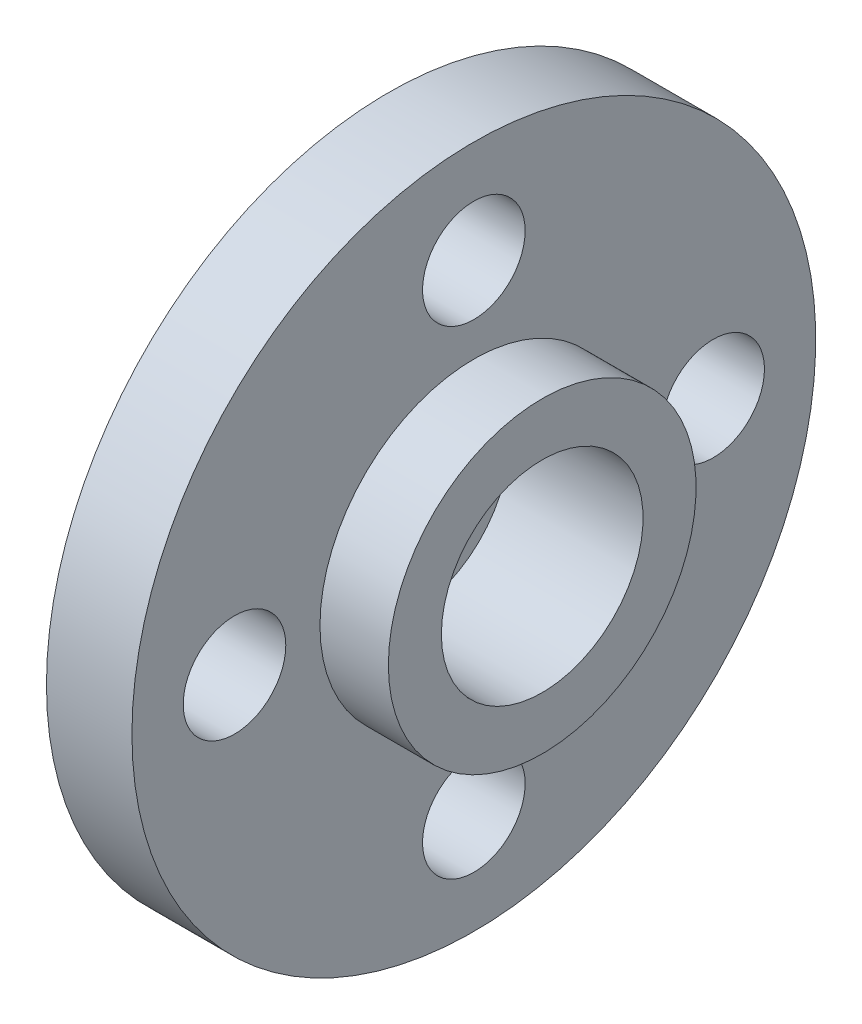
ISO-10303-21;
HEADER;
FILE_DESCRIPTION(('STEP AP214'),'2;1');
FILE_NAME('part.step','',(''),(''),'','','');
FILE_SCHEMA(('AUTOMOTIVE_DESIGN { 1 0 10303 214 1 1 1 1 }'));
ENDSEC;
DATA;
#1=APPLICATION_CONTEXT('core data for automotive mechanical design processes');
#2=APPLICATION_PROTOCOL_DEFINITION('international standard','automotive_design',2000,#1);
#3=PRODUCT_CONTEXT('',#1,'mechanical');
#4=PRODUCT('Part','Part','',(#3));
#5=PRODUCT_RELATED_PRODUCT_CATEGORY('part','',(#4));
#6=PRODUCT_DEFINITION_FORMATION('','',#4);
#7=PRODUCT_DEFINITION_CONTEXT('part definition',#1,'design');
#8=PRODUCT_DEFINITION('design','',#6,#7);
#9=PRODUCT_DEFINITION_SHAPE('','',#8);
#10=(LENGTH_UNIT() NAMED_UNIT(*) SI_UNIT(.MILLI.,.METRE.));
#11=(NAMED_UNIT(*) PLANE_ANGLE_UNIT() SI_UNIT($,.RADIAN.));
#12=(NAMED_UNIT(*) SI_UNIT($,.STERADIAN.) SOLID_ANGLE_UNIT());
#13=UNCERTAINTY_MEASURE_WITH_UNIT(LENGTH_MEASURE(1.E-05),#10,'distance_accuracy_value','');
#14=(GEOMETRIC_REPRESENTATION_CONTEXT(3) GLOBAL_UNCERTAINTY_ASSIGNED_CONTEXT((#13)) GLOBAL_UNIT_ASSIGNED_CONTEXT((#10,
#11,#12)) REPRESENTATION_CONTEXT('',''));
#15=CARTESIAN_POINT('',(0.,0.,0.));
#16=DIRECTION('',(0.,0.,1.));
#17=DIRECTION('',(1.,0.,0.));
#18=AXIS2_PLACEMENT_3D('',#15,#16,#17);
#19=CARTESIAN_POINT('',(-8.58843537414966,0.,0.));
#20=DIRECTION('',(-1.,0.,0.));
#21=DIRECTION('',(0.,0.,1.));
#22=AXIS2_PLACEMENT_3D('',#19,#20,#21);
#23=CYLINDRICAL_SURFACE('',#22,10.);
#24=CARTESIAN_POINT('',(-2.57936507936508,0.,0.));
#25=DIRECTION('',(-1.,0.,0.));
#26=DIRECTION('',(0.,0.,1.));
#27=AXIS2_PLACEMENT_3D('',#24,#25,#26);
#28=CIRCLE('',#27,10.);
#29=CARTESIAN_POINT('',(-2.57936507936508,0.,10.));
#30=VERTEX_POINT('',#29);
#31=EDGE_CURVE('E62',#30,#30,#28,.T.);
#32=ORIENTED_EDGE('',*,*,#31,.F.);
#33=EDGE_LOOP('',(#32));
#34=FACE_BOUND('',#33,.T.);
#35=CARTESIAN_POINT('',(-0.0793650793650784,0.,0.));
#36=DIRECTION('',(-1.,0.,0.));
#37=DIRECTION('',(0.,0.,1.));
#38=AXIS2_PLACEMENT_3D('',#35,#36,#37);
#39=CIRCLE('',#38,10.);
#40=CARTESIAN_POINT('',(-0.0793650793650784,0.,10.));
#41=VERTEX_POINT('',#40);
#42=EDGE_CURVE('E10',#41,#41,#39,.T.);
#43=ORIENTED_EDGE('',*,*,#42,.T.);
#44=EDGE_LOOP('',(#43));
#45=FACE_BOUND('',#44,.T.);
#46=ADVANCED_FACE('F35',(#34,#45),#23,.T.);
#47=CARTESIAN_POINT('',(-0.0793650793650785,10.,0.));
#48=DIRECTION('',(-1.,0.,0.));
#49=DIRECTION('',(0.,0.,1.));
#50=AXIS2_PLACEMENT_3D('',#47,#48,#49);
#51=PLANE('',#50);
#52=CARTESIAN_POINT('',(-0.0793650793650785,7.,0.));
#53=DIRECTION('',(1.,0.,0.));
#54=DIRECTION('',(0.,0.,-1.));
#55=AXIS2_PLACEMENT_3D('',#52,#53,#54);
#56=CIRCLE('',#55,1.5);
#57=CARTESIAN_POINT('',(-0.0793650793650785,7.,-1.5));
#58=VERTEX_POINT('',#57);
#59=EDGE_CURVE('E55',#58,#58,#56,.T.);
#60=ORIENTED_EDGE('',*,*,#59,.F.);
#61=EDGE_LOOP('',(#60));
#62=FACE_BOUND('',#61,.T.);
#63=CARTESIAN_POINT('',(-0.0793650793650785,0.,-7.));
#64=DIRECTION('',(1.,0.,0.));
#65=DIRECTION('',(0.,0.,-1.));
#66=AXIS2_PLACEMENT_3D('',#63,#64,#65);
#67=CIRCLE('',#66,1.5);
#68=CARTESIAN_POINT('',(-0.0793650793650785,0.,-8.5));
#69=VERTEX_POINT('',#68);
#70=EDGE_CURVE('E141',#69,#69,#67,.T.);
#71=ORIENTED_EDGE('',*,*,#70,.F.);
#72=EDGE_LOOP('',(#71));
#73=FACE_BOUND('',#72,.T.);
#74=CARTESIAN_POINT('',(-0.0793650793650785,-7.,-1.96380207734619E-13));
#75=DIRECTION('',(1.,0.,0.));
#76=DIRECTION('',(0.,0.,-1.));
#77=AXIS2_PLACEMENT_3D('',#74,#75,#76);
#78=CIRCLE('',#77,1.50000000000023);
#79=CARTESIAN_POINT('',(-0.0793650793650785,-7.,-1.50000000000043));
#80=VERTEX_POINT('',#79);
#81=EDGE_CURVE('E145',#80,#80,#78,.T.);
#82=ORIENTED_EDGE('',*,*,#81,.F.);
#83=EDGE_LOOP('',(#82));
#84=FACE_BOUND('',#83,.T.);
#85=CARTESIAN_POINT('',(-0.0793650793650785,0.,6.9999999999999));
#86=DIRECTION('',(1.,0.,0.));
#87=DIRECTION('',(0.,0.,-1.));
#88=AXIS2_PLACEMENT_3D('',#85,#86,#87);
#89=CIRCLE('',#88,1.50000000000019);
#90=CARTESIAN_POINT('',(-0.0793650793650785,0.,5.49999999999971));
#91=VERTEX_POINT('',#90);
#92=EDGE_CURVE('E74',#91,#91,#89,.T.);
#93=ORIENTED_EDGE('',*,*,#92,.F.);
#94=EDGE_LOOP('',(#93));
#95=FACE_BOUND('',#94,.T.);
#96=ORIENTED_EDGE('',*,*,#42,.F.);
#97=EDGE_LOOP('',(#96));
#98=FACE_BOUND('',#97,.T.);
#99=CARTESIAN_POINT('',(-0.0793650793650784,0.,0.));
#100=DIRECTION('',(-1.,0.,0.));
#101=DIRECTION('',(0.,0.,1.));
#102=AXIS2_PLACEMENT_3D('',#99,#100,#101);
#103=CIRCLE('',#102,4.5);
#104=CARTESIAN_POINT('',(-0.0793650793650784,0.,4.5));
#105=VERTEX_POINT('',#104);
#106=EDGE_CURVE('E42',#105,#105,#103,.T.);
#107=ORIENTED_EDGE('',*,*,#106,.T.);
#108=EDGE_LOOP('',(#107));
#109=FACE_BOUND('',#108,.T.);
#110=ADVANCED_FACE('F124',(#62,#73,#84,#95,#98,#109),#51,.F.);
#111=CARTESIAN_POINT('',(-8.58843537414966,0.,0.));
#112=DIRECTION('',(-1.,0.,0.));
#113=DIRECTION('',(0.,0.,1.));
#114=AXIS2_PLACEMENT_3D('',#111,#112,#113);
#115=CYLINDRICAL_SURFACE('',#114,4.5);
#116=ORIENTED_EDGE('',*,*,#106,.F.);
#117=EDGE_LOOP('',(#116));
#118=FACE_BOUND('',#117,.T.);
#119=CARTESIAN_POINT('',(1.92063492063492,0.,0.));
#120=DIRECTION('',(-1.,0.,0.));
#121=DIRECTION('',(0.,0.,1.));
#122=AXIS2_PLACEMENT_3D('',#119,#120,#121);
#123=CIRCLE('',#122,4.5);
#124=CARTESIAN_POINT('',(1.92063492063492,0.,4.5));
#125=VERTEX_POINT('',#124);
#126=EDGE_CURVE('E47',#125,#125,#123,.T.);
#127=ORIENTED_EDGE('',*,*,#126,.T.);
#128=EDGE_LOOP('',(#127));
#129=FACE_BOUND('',#128,.T.);
#130=ADVANCED_FACE('F87',(#118,#129),#115,.T.);
#131=CARTESIAN_POINT('',(1.92063492063492,4.5,0.));
#132=DIRECTION('',(-1.,0.,0.));
#133=DIRECTION('',(0.,0.,1.));
#134=AXIS2_PLACEMENT_3D('',#131,#132,#133);
#135=PLANE('',#134);
#136=ORIENTED_EDGE('',*,*,#126,.F.);
#137=EDGE_LOOP('',(#136));
#138=FACE_BOUND('',#137,.T.);
#139=CARTESIAN_POINT('',(1.92063492063492,0.,0.));
#140=DIRECTION('',(-1.,0.,0.));
#141=DIRECTION('',(0.,0.,1.));
#142=AXIS2_PLACEMENT_3D('',#139,#140,#141);
#143=CIRCLE('',#142,2.95);
#144=CARTESIAN_POINT('',(1.92063492063492,0.,2.95));
#145=VERTEX_POINT('',#144);
#146=EDGE_CURVE('E82',#145,#145,#143,.T.);
#147=ORIENTED_EDGE('',*,*,#146,.T.);
#148=EDGE_LOOP('',(#147));
#149=FACE_BOUND('',#148,.T.);
#150=ADVANCED_FACE('F89',(#138,#149),#135,.F.);
#151=CARTESIAN_POINT('',(-8.58843537414966,0.,0.));
#152=DIRECTION('',(-1.,0.,0.));
#153=DIRECTION('',(0.,0.,1.));
#154=AXIS2_PLACEMENT_3D('',#151,#152,#153);
#155=CYLINDRICAL_SURFACE('',#154,2.95);
#156=ORIENTED_EDGE('',*,*,#146,.F.);
#157=EDGE_LOOP('',(#156));
#158=FACE_BOUND('',#157,.T.);
#159=CARTESIAN_POINT('',(-1.98979591836735,0.,0.));
#160=DIRECTION('',(-1.,0.,0.));
#161=DIRECTION('',(0.,0.,1.));
#162=AXIS2_PLACEMENT_3D('',#159,#160,#161);
#163=CIRCLE('',#162,2.95);
#164=CARTESIAN_POINT('',(-1.98979591836735,0.,2.95));
#165=VERTEX_POINT('',#164);
#166=EDGE_CURVE('E79',#165,#165,#163,.T.);
#167=ORIENTED_EDGE('',*,*,#166,.T.);
#168=EDGE_LOOP('',(#167));
#169=FACE_BOUND('',#168,.T.);
#170=ADVANCED_FACE('F92',(#158,#169),#155,.F.);
#171=CARTESIAN_POINT('',(-1.98979591836735,2.95,0.));
#172=DIRECTION('',(-1.,0.,0.));
#173=DIRECTION('',(0.,0.,1.));
#174=AXIS2_PLACEMENT_3D('',#171,#172,#173);
#175=PLANE('',#174);
#176=ORIENTED_EDGE('',*,*,#166,.F.);
#177=EDGE_LOOP('',(#176));
#178=FACE_BOUND('',#177,.T.);
#179=CARTESIAN_POINT('',(-1.98979591836735,0.,0.));
#180=DIRECTION('',(-1.,0.,0.));
#181=DIRECTION('',(0.,0.,1.));
#182=AXIS2_PLACEMENT_3D('',#179,#180,#181);
#183=CIRCLE('',#182,1.5);
#184=CARTESIAN_POINT('',(-1.98979591836735,0.,1.5));
#185=VERTEX_POINT('',#184);
#186=EDGE_CURVE('E71',#185,#185,#183,.T.);
#187=ORIENTED_EDGE('',*,*,#186,.T.);
#188=EDGE_LOOP('',(#187));
#189=FACE_BOUND('',#188,.T.);
#190=ADVANCED_FACE('F98',(#178,#189),#175,.F.);
#191=CARTESIAN_POINT('',(-8.58843537414966,0.,0.));
#192=DIRECTION('',(-1.,0.,0.));
#193=DIRECTION('',(0.,0.,1.));
#194=AXIS2_PLACEMENT_3D('',#191,#192,#193);
#195=CYLINDRICAL_SURFACE('',#194,1.5);
#196=ORIENTED_EDGE('',*,*,#186,.F.);
#197=EDGE_LOOP('',(#196));
#198=FACE_BOUND('',#197,.T.);
#199=CARTESIAN_POINT('',(-2.57936507936508,0.,0.));
#200=DIRECTION('',(-1.,0.,0.));
#201=DIRECTION('',(0.,0.,1.));
#202=AXIS2_PLACEMENT_3D('',#199,#200,#201);
#203=CIRCLE('',#202,1.5);
#204=CARTESIAN_POINT('',(-2.57936507936508,0.,1.5));
#205=VERTEX_POINT('',#204);
#206=EDGE_CURVE('E66',#205,#205,#203,.T.);
#207=ORIENTED_EDGE('',*,*,#206,.T.);
#208=EDGE_LOOP('',(#207));
#209=FACE_BOUND('',#208,.T.);
#210=ADVANCED_FACE('F104',(#198,#209),#195,.F.);
#211=CARTESIAN_POINT('',(-2.57936507936508,1.5,0.));
#212=DIRECTION('',(1.,0.,0.));
#213=DIRECTION('',(0.,0.,-1.));
#214=AXIS2_PLACEMENT_3D('',#211,#212,#213);
#215=PLANE('',#214);
#216=CARTESIAN_POINT('',(-2.57936507936508,7.,0.));
#217=DIRECTION('',(1.,0.,0.));
#218=DIRECTION('',(0.,0.,-1.));
#219=AXIS2_PLACEMENT_3D('',#216,#217,#218);
#220=CIRCLE('',#219,1.5);
#221=CARTESIAN_POINT('',(-2.57936507936508,7.,-1.5));
#222=VERTEX_POINT('',#221);
#223=EDGE_CURVE('E38',#222,#222,#220,.T.);
#224=ORIENTED_EDGE('',*,*,#223,.T.);
#225=EDGE_LOOP('',(#224));
#226=FACE_BOUND('',#225,.T.);
#227=CARTESIAN_POINT('',(-2.57936507936508,0.,-7.));
#228=DIRECTION('',(1.,0.,0.));
#229=DIRECTION('',(0.,0.,-1.));
#230=AXIS2_PLACEMENT_3D('',#227,#228,#229);
#231=CIRCLE('',#230,1.5);
#232=CARTESIAN_POINT('',(-2.57936507936508,0.,-8.5));
#233=VERTEX_POINT('',#232);
#234=EDGE_CURVE('E57',#233,#233,#231,.T.);
#235=ORIENTED_EDGE('',*,*,#234,.T.);
#236=EDGE_LOOP('',(#235));
#237=FACE_BOUND('',#236,.T.);
#238=CARTESIAN_POINT('',(-2.57936507936508,-7.,-1.96380207734619E-13));
#239=DIRECTION('',(1.,0.,0.));
#240=DIRECTION('',(0.,0.,-1.));
#241=AXIS2_PLACEMENT_3D('',#238,#239,#240);
#242=CIRCLE('',#241,1.50000000000023);
#243=CARTESIAN_POINT('',(-2.57936507936508,-7.,-1.50000000000043));
#244=VERTEX_POINT('',#243);
#245=EDGE_CURVE('E54',#244,#244,#242,.T.);
#246=ORIENTED_EDGE('',*,*,#245,.T.);
#247=EDGE_LOOP('',(#246));
#248=FACE_BOUND('',#247,.T.);
#249=CARTESIAN_POINT('',(-2.57936507936508,0.,6.9999999999999));
#250=DIRECTION('',(1.,0.,0.));
#251=DIRECTION('',(0.,0.,-1.));
#252=AXIS2_PLACEMENT_3D('',#249,#250,#251);
#253=CIRCLE('',#252,1.50000000000019);
#254=CARTESIAN_POINT('',(-2.57936507936508,0.,5.49999999999971));
#255=VERTEX_POINT('',#254);
#256=EDGE_CURVE('E51',#255,#255,#253,.T.);
#257=ORIENTED_EDGE('',*,*,#256,.T.);
#258=EDGE_LOOP('',(#257));
#259=FACE_BOUND('',#258,.T.);
#260=ORIENTED_EDGE('',*,*,#206,.F.);
#261=EDGE_LOOP('',(#260));
#262=FACE_BOUND('',#261,.T.);
#263=ORIENTED_EDGE('',*,*,#31,.T.);
#264=EDGE_LOOP('',(#263));
#265=FACE_BOUND('',#264,.T.);
#266=ADVANCED_FACE('F110',(#226,#237,#248,#259,#262,#265),#215,.F.);
#267=CARTESIAN_POINT('',(-10.0793650793651,0.,6.9999999999999));
#268=DIRECTION('',(1.,0.,0.));
#269=DIRECTION('',(0.,0.,-1.));
#270=AXIS2_PLACEMENT_3D('',#267,#268,#269);
#271=CYLINDRICAL_SURFACE('',#270,1.50000000000019);
#272=ORIENTED_EDGE('',*,*,#92,.T.);
#273=EDGE_LOOP('',(#272));
#274=FACE_BOUND('',#273,.T.);
#275=ORIENTED_EDGE('',*,*,#256,.F.);
#276=EDGE_LOOP('',(#275));
#277=FACE_BOUND('',#276,.T.);
#278=ADVANCED_FACE('F115',(#274,#277),#271,.F.);
#279=CARTESIAN_POINT('',(-10.0793650793651,-7.,-1.96380207734619E-13));
#280=DIRECTION('',(1.,0.,0.));
#281=DIRECTION('',(0.,0.,-1.));
#282=AXIS2_PLACEMENT_3D('',#279,#280,#281);
#283=CYLINDRICAL_SURFACE('',#282,1.50000000000023);
#284=ORIENTED_EDGE('',*,*,#81,.T.);
#285=EDGE_LOOP('',(#284));
#286=FACE_BOUND('',#285,.T.);
#287=ORIENTED_EDGE('',*,*,#245,.F.);
#288=EDGE_LOOP('',(#287));
#289=FACE_BOUND('',#288,.T.);
#290=ADVANCED_FACE('F120',(#286,#289),#283,.F.);
#291=CARTESIAN_POINT('',(-10.0793650793651,0.,-7.));
#292=DIRECTION('',(1.,0.,0.));
#293=DIRECTION('',(0.,0.,-1.));
#294=AXIS2_PLACEMENT_3D('',#291,#292,#293);
#295=CYLINDRICAL_SURFACE('',#294,1.5);
#296=ORIENTED_EDGE('',*,*,#70,.T.);
#297=EDGE_LOOP('',(#296));
#298=FACE_BOUND('',#297,.T.);
#299=ORIENTED_EDGE('',*,*,#234,.F.);
#300=EDGE_LOOP('',(#299));
#301=FACE_BOUND('',#300,.T.);
#302=ADVANCED_FACE('F158',(#298,#301),#295,.F.);
#303=CARTESIAN_POINT('',(-10.0793650793651,7.,0.));
#304=DIRECTION('',(1.,0.,0.));
#305=DIRECTION('',(0.,0.,-1.));
#306=AXIS2_PLACEMENT_3D('',#303,#304,#305);
#307=CYLINDRICAL_SURFACE('',#306,1.5);
#308=ORIENTED_EDGE('',*,*,#59,.T.);
#309=EDGE_LOOP('',(#308));
#310=FACE_BOUND('',#309,.T.);
#311=ORIENTED_EDGE('',*,*,#223,.F.);
#312=EDGE_LOOP('',(#311));
#313=FACE_BOUND('',#312,.T.);
#314=ADVANCED_FACE('F155',(#310,#313),#307,.F.);
#315=CLOSED_SHELL('',(#46,#110,#130,#150,#170,#190,#210,#266,#278,#290,#302,#314));
#316=MANIFOLD_SOLID_BREP('B2',#315);
#317=ADVANCED_BREP_SHAPE_REPRESENTATION('',(#18,#316),#14);
#318=SHAPE_DEFINITION_REPRESENTATION(#9,#317);
ENDSEC;
END-ISO-10303-21;
